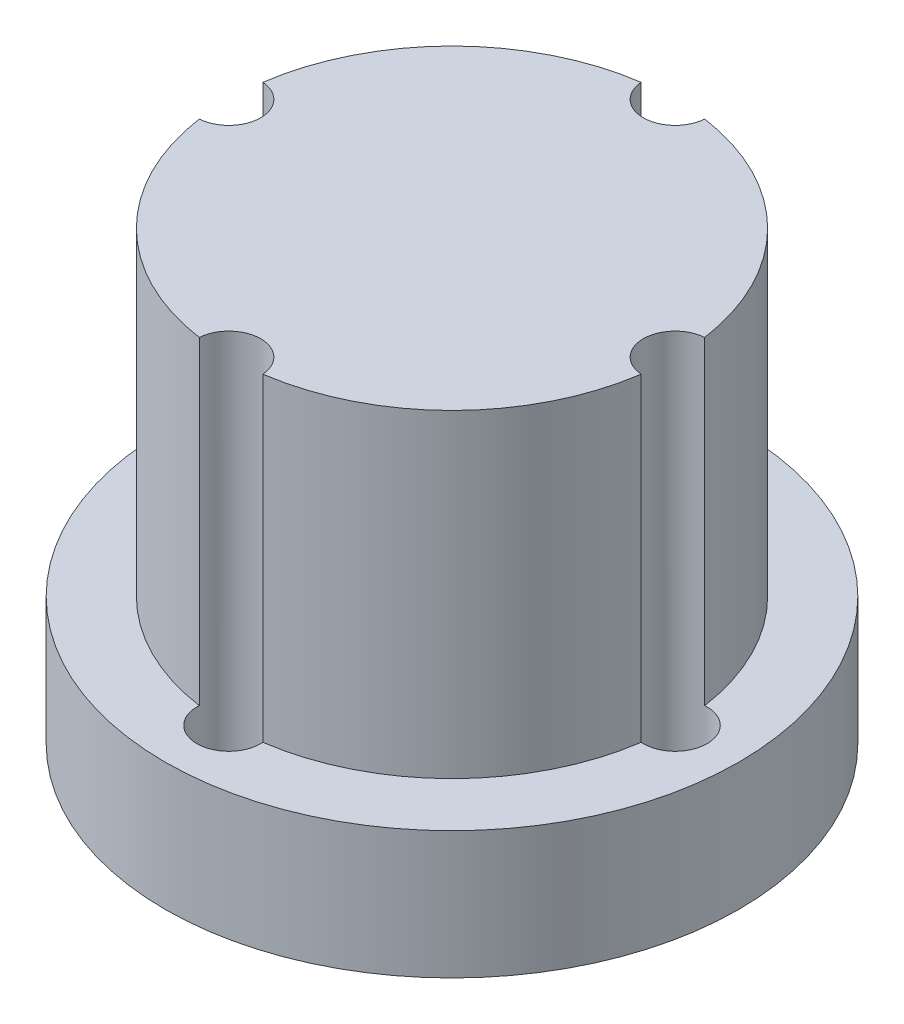
ISO-10303-21;
HEADER;
FILE_DESCRIPTION(('STEP AP214'),'2;1');
FILE_NAME('part.step','',(''),(''),'','','');
FILE_SCHEMA(('AUTOMOTIVE_DESIGN { 1 0 10303 214 1 1 1 1 }'));
ENDSEC;
DATA;
#1=APPLICATION_CONTEXT('core data for automotive mechanical design processes');
#2=APPLICATION_PROTOCOL_DEFINITION('international standard','automotive_design',2000,#1);
#3=PRODUCT_CONTEXT('',#1,'mechanical');
#4=PRODUCT('Part','Part','',(#3));
#5=PRODUCT_RELATED_PRODUCT_CATEGORY('part','',(#4));
#6=PRODUCT_DEFINITION_FORMATION('','',#4);
#7=PRODUCT_DEFINITION_CONTEXT('part definition',#1,'design');
#8=PRODUCT_DEFINITION('design','',#6,#7);
#9=PRODUCT_DEFINITION_SHAPE('','',#8);
#10=(LENGTH_UNIT() NAMED_UNIT(*) SI_UNIT(.MILLI.,.METRE.));
#11=(NAMED_UNIT(*) PLANE_ANGLE_UNIT() SI_UNIT($,.RADIAN.));
#12=(NAMED_UNIT(*) SI_UNIT($,.STERADIAN.) SOLID_ANGLE_UNIT());
#13=UNCERTAINTY_MEASURE_WITH_UNIT(LENGTH_MEASURE(1.E-05),#10,'distance_accuracy_value','');
#14=(GEOMETRIC_REPRESENTATION_CONTEXT(3) GLOBAL_UNCERTAINTY_ASSIGNED_CONTEXT((#13)) GLOBAL_UNIT_ASSIGNED_CONTEXT((#10,
#11,#12)) REPRESENTATION_CONTEXT('',''));
#15=CARTESIAN_POINT('',(0.,0.,0.));
#16=DIRECTION('',(0.,0.,1.));
#17=DIRECTION('',(1.,0.,0.));
#18=AXIS2_PLACEMENT_3D('',#15,#16,#17);
#19=CARTESIAN_POINT('',(0.,14.,0.));
#20=DIRECTION('',(0.,-1.,0.));
#21=DIRECTION('',(0.,0.,-1.));
#22=AXIS2_PLACEMENT_3D('',#19,#20,#21);
#23=CYLINDRICAL_SURFACE('',#22,9.);
#24=CARTESIAN_POINT('',(0.,0.,0.));
#25=DIRECTION('',(0.,1.,0.));
#26=DIRECTION('',(0.,0.,1.));
#27=AXIS2_PLACEMENT_3D('',#24,#25,#26);
#28=CIRCLE('',#27,9.);
#29=CARTESIAN_POINT('',(0.,0.,9.));
#30=VERTEX_POINT('',#29);
#31=EDGE_CURVE('E143',#30,#30,#28,.T.);
#32=ORIENTED_EDGE('',*,*,#31,.T.);
#33=EDGE_LOOP('',(#32));
#34=FACE_BOUND('',#33,.T.);
#35=CARTESIAN_POINT('',(0.,4.,0.));
#36=DIRECTION('',(0.,1.,0.));
#37=DIRECTION('',(0.,0.,1.));
#38=AXIS2_PLACEMENT_3D('',#35,#36,#37);
#39=CIRCLE('',#38,9.);
#40=CARTESIAN_POINT('',(0.,4.,9.));
#41=VERTEX_POINT('',#40);
#42=EDGE_CURVE('E116',#41,#41,#39,.T.);
#43=ORIENTED_EDGE('',*,*,#42,.F.);
#44=EDGE_LOOP('',(#43));
#45=FACE_BOUND('',#44,.T.);
#46=ADVANCED_FACE('F33',(#34,#45),#23,.T.);
#47=CARTESIAN_POINT('',(0.,14.,0.));
#48=DIRECTION('',(0.,1.,0.));
#49=DIRECTION('',(0.,0.,1.));
#50=AXIS2_PLACEMENT_3D('',#47,#48,#49);
#51=PLANE('',#50);
#52=CARTESIAN_POINT('',(0.,14.,7.));
#53=DIRECTION('',(0.,1.,0.));
#54=DIRECTION('',(0.,0.,1.));
#55=AXIS2_PLACEMENT_3D('',#52,#53,#54);
#56=CIRCLE('',#55,1.);
#57=CARTESIAN_POINT('',(0.997445717412067,14.,6.92857142857143));
#58=VERTEX_POINT('',#57);
#59=CARTESIAN_POINT('',(-0.997445717412068,14.,6.92857142857143));
#60=VERTEX_POINT('',#59);
#61=EDGE_CURVE('E124',#58,#60,#56,.T.);
#62=ORIENTED_EDGE('',*,*,#61,.F.);
#63=CARTESIAN_POINT('',(0.,14.,0.));
#64=DIRECTION('',(0.,1.,0.));
#65=DIRECTION('',(0.,0.,1.));
#66=AXIS2_PLACEMENT_3D('',#63,#64,#65);
#67=CIRCLE('',#66,7.);
#68=CARTESIAN_POINT('',(6.92857142857143,14.,0.997445717412068));
#69=VERTEX_POINT('',#68);
#70=EDGE_CURVE('E103',#58,#69,#67,.T.);
#71=ORIENTED_EDGE('',*,*,#70,.T.);
#72=CARTESIAN_POINT('',(7.,14.,0.));
#73=DIRECTION('',(0.,1.,0.));
#74=DIRECTION('',(0.,0.,1.));
#75=AXIS2_PLACEMENT_3D('',#72,#73,#74);
#76=CIRCLE('',#75,1.);
#77=CARTESIAN_POINT('',(6.92857142857143,14.,-0.997445717412068));
#78=VERTEX_POINT('',#77);
#79=EDGE_CURVE('E130',#78,#69,#76,.T.);
#80=ORIENTED_EDGE('',*,*,#79,.F.);
#81=CARTESIAN_POINT('',(0.997445717412066,14.,-6.92857142857143));
#82=VERTEX_POINT('',#81);
#83=EDGE_CURVE('E47',#78,#82,#67,.T.);
#84=ORIENTED_EDGE('',*,*,#83,.T.);
#85=CARTESIAN_POINT('',(0.,14.,-7.));
#86=DIRECTION('',(0.,1.,0.));
#87=DIRECTION('',(0.,0.,1.));
#88=AXIS2_PLACEMENT_3D('',#85,#86,#87);
#89=CIRCLE('',#88,0.999999999999999);
#90=CARTESIAN_POINT('',(-0.997445717412065,14.,-6.92857142857143));
#91=VERTEX_POINT('',#90);
#92=EDGE_CURVE('E138',#91,#82,#89,.T.);
#93=ORIENTED_EDGE('',*,*,#92,.F.);
#94=CARTESIAN_POINT('',(-6.92857142857143,14.,-0.997445717412068));
#95=VERTEX_POINT('',#94);
#96=EDGE_CURVE('E169',#91,#95,#67,.T.);
#97=ORIENTED_EDGE('',*,*,#96,.T.);
#98=CARTESIAN_POINT('',(-7.,14.,0.));
#99=DIRECTION('',(0.,1.,0.));
#100=DIRECTION('',(0.,0.,1.));
#101=AXIS2_PLACEMENT_3D('',#98,#99,#100);
#102=CIRCLE('',#101,1.);
#103=CARTESIAN_POINT('',(-6.92857142857143,14.,0.997445717412067));
#104=VERTEX_POINT('',#103);
#105=EDGE_CURVE('E134',#104,#95,#102,.T.);
#106=ORIENTED_EDGE('',*,*,#105,.F.);
#107=EDGE_CURVE('E168',#104,#60,#67,.T.);
#108=ORIENTED_EDGE('',*,*,#107,.T.);
#109=EDGE_LOOP('',(#62,#71,#80,#84,#93,#97,#106,#108));
#110=FACE_BOUND('',#109,.T.);
#111=ADVANCED_FACE('F166',(#110),#51,.T.);
#112=CARTESIAN_POINT('',(0.,-6.,-7.));
#113=DIRECTION('',(0.,1.,0.));
#114=DIRECTION('',(0.,0.,1.));
#115=AXIS2_PLACEMENT_3D('',#112,#113,#114);
#116=CYLINDRICAL_SURFACE('',#115,0.999999999999999);
#117=CARTESIAN_POINT('',(0.,0.,-7.));
#118=DIRECTION('',(0.,1.,0.));
#119=DIRECTION('',(0.,0.,1.));
#120=AXIS2_PLACEMENT_3D('',#117,#118,#119);
#121=CIRCLE('',#120,0.999999999999999);
#122=CARTESIAN_POINT('',(0.,0.,-6.));
#123=VERTEX_POINT('',#122);
#124=EDGE_CURVE('E141',#123,#123,#121,.T.);
#125=ORIENTED_EDGE('',*,*,#124,.F.);
#126=EDGE_LOOP('',(#125));
#127=FACE_BOUND('',#126,.T.);
#128=DIRECTION('',(0.,1.,0.));
#129=VECTOR('',#128,1.);
#130=CARTESIAN_POINT('',(0.997445717412066,9.,-6.92857142857143));
#131=LINE('',#130,#129);
#132=CARTESIAN_POINT('',(0.997445717412066,4.,-6.92857142857143));
#133=VERTEX_POINT('',#132);
#134=EDGE_CURVE('E126',#133,#82,#131,.T.);
#135=ORIENTED_EDGE('',*,*,#134,.F.);
#136=CARTESIAN_POINT('',(0.,4.,-7.));
#137=DIRECTION('',(0.,1.,0.));
#138=DIRECTION('',(0.,0.,1.));
#139=AXIS2_PLACEMENT_3D('',#136,#137,#138);
#140=CIRCLE('',#139,0.999999999999999);
#141=CARTESIAN_POINT('',(-0.997445717412065,4.,-6.92857142857143));
#142=VERTEX_POINT('',#141);
#143=EDGE_CURVE('E121',#142,#133,#140,.F.);
#144=ORIENTED_EDGE('',*,*,#143,.F.);
#145=DIRECTION('',(0.,1.,0.));
#146=VECTOR('',#145,1.);
#147=CARTESIAN_POINT('',(-0.997445717412066,9.,-6.92857142857143));
#148=LINE('',#147,#146);
#149=EDGE_CURVE('E187',#91,#142,#148,.F.);
#150=ORIENTED_EDGE('',*,*,#149,.F.);
#151=ORIENTED_EDGE('',*,*,#92,.T.);
#152=EDGE_LOOP('',(#135,#144,#150,#151));
#153=FACE_BOUND('',#152,.T.);
#154=ADVANCED_FACE('F189',(#127,#153),#116,.F.);
#155=CARTESIAN_POINT('',(0.,-6.,7.));
#156=DIRECTION('',(0.,1.,0.));
#157=DIRECTION('',(0.,0.,1.));
#158=AXIS2_PLACEMENT_3D('',#155,#156,#157);
#159=CYLINDRICAL_SURFACE('',#158,1.);
#160=CARTESIAN_POINT('',(0.,0.,7.));
#161=DIRECTION('',(0.,1.,0.));
#162=DIRECTION('',(0.,0.,1.));
#163=AXIS2_PLACEMENT_3D('',#160,#161,#162);
#164=CIRCLE('',#163,1.);
#165=CARTESIAN_POINT('',(0.,0.,8.));
#166=VERTEX_POINT('',#165);
#167=EDGE_CURVE('E133',#166,#166,#164,.T.);
#168=ORIENTED_EDGE('',*,*,#167,.F.);
#169=EDGE_LOOP('',(#168));
#170=FACE_BOUND('',#169,.T.);
#171=DIRECTION('',(0.,1.,0.));
#172=VECTOR('',#171,1.);
#173=CARTESIAN_POINT('',(-0.997445717412068,9.,6.92857142857143));
#174=LINE('',#173,#172);
#175=CARTESIAN_POINT('',(-0.997445717412068,4.,6.92857142857143));
#176=VERTEX_POINT('',#175);
#177=EDGE_CURVE('E55',#176,#60,#174,.T.);
#178=ORIENTED_EDGE('',*,*,#177,.F.);
#179=CARTESIAN_POINT('',(0.,4.,7.));
#180=DIRECTION('',(0.,1.,0.));
#181=DIRECTION('',(0.,0.,1.));
#182=AXIS2_PLACEMENT_3D('',#179,#180,#181);
#183=CIRCLE('',#182,1.);
#184=CARTESIAN_POINT('',(0.997445717412067,4.,6.92857142857143));
#185=VERTEX_POINT('',#184);
#186=EDGE_CURVE('E113',#185,#176,#183,.F.);
#187=ORIENTED_EDGE('',*,*,#186,.F.);
#188=DIRECTION('',(0.,1.,0.));
#189=VECTOR('',#188,1.);
#190=CARTESIAN_POINT('',(0.997445717412068,9.,6.92857142857143));
#191=LINE('',#190,#189);
#192=EDGE_CURVE('E97',#58,#185,#191,.F.);
#193=ORIENTED_EDGE('',*,*,#192,.F.);
#194=ORIENTED_EDGE('',*,*,#61,.T.);
#195=EDGE_LOOP('',(#178,#187,#193,#194));
#196=FACE_BOUND('',#195,.T.);
#197=ADVANCED_FACE('F120',(#170,#196),#159,.F.);
#198=CARTESIAN_POINT('',(-7.,-6.,0.));
#199=DIRECTION('',(0.,1.,0.));
#200=DIRECTION('',(0.,0.,1.));
#201=AXIS2_PLACEMENT_3D('',#198,#199,#200);
#202=CYLINDRICAL_SURFACE('',#201,1.);
#203=CARTESIAN_POINT('',(-7.,0.,0.));
#204=DIRECTION('',(0.,1.,0.));
#205=DIRECTION('',(0.,0.,1.));
#206=AXIS2_PLACEMENT_3D('',#203,#204,#205);
#207=CIRCLE('',#206,1.);
#208=CARTESIAN_POINT('',(-7.,0.,1.));
#209=VERTEX_POINT('',#208);
#210=EDGE_CURVE('E151',#209,#209,#207,.T.);
#211=ORIENTED_EDGE('',*,*,#210,.F.);
#212=EDGE_LOOP('',(#211));
#213=FACE_BOUND('',#212,.T.);
#214=DIRECTION('',(0.,1.,0.));
#215=VECTOR('',#214,1.);
#216=CARTESIAN_POINT('',(-6.92857142857143,9.,-0.997445717412068));
#217=LINE('',#216,#215);
#218=CARTESIAN_POINT('',(-6.92857142857143,4.,-0.997445717412068));
#219=VERTEX_POINT('',#218);
#220=EDGE_CURVE('E108',#219,#95,#217,.T.);
#221=ORIENTED_EDGE('',*,*,#220,.F.);
#222=CARTESIAN_POINT('',(-7.,4.,0.));
#223=DIRECTION('',(0.,1.,0.));
#224=DIRECTION('',(0.,0.,1.));
#225=AXIS2_PLACEMENT_3D('',#222,#223,#224);
#226=CIRCLE('',#225,1.);
#227=CARTESIAN_POINT('',(-6.92857142857143,4.,0.997445717412067));
#228=VERTEX_POINT('',#227);
#229=EDGE_CURVE('E122',#228,#219,#226,.F.);
#230=ORIENTED_EDGE('',*,*,#229,.F.);
#231=DIRECTION('',(0.,1.,0.));
#232=VECTOR('',#231,1.);
#233=CARTESIAN_POINT('',(-6.92857142857143,9.,0.997445717412068));
#234=LINE('',#233,#232);
#235=EDGE_CURVE('E181',#104,#228,#234,.F.);
#236=ORIENTED_EDGE('',*,*,#235,.F.);
#237=ORIENTED_EDGE('',*,*,#105,.T.);
#238=EDGE_LOOP('',(#221,#230,#236,#237));
#239=FACE_BOUND('',#238,.T.);
#240=ADVANCED_FACE('F179',(#213,#239),#202,.F.);
#241=CARTESIAN_POINT('',(7.,-6.,0.));
#242=DIRECTION('',(0.,1.,0.));
#243=DIRECTION('',(0.,0.,1.));
#244=AXIS2_PLACEMENT_3D('',#241,#242,#243);
#245=CYLINDRICAL_SURFACE('',#244,1.);
#246=CARTESIAN_POINT('',(7.,0.,0.));
#247=DIRECTION('',(0.,1.,0.));
#248=DIRECTION('',(0.,0.,1.));
#249=AXIS2_PLACEMENT_3D('',#246,#247,#248);
#250=CIRCLE('',#249,1.);
#251=CARTESIAN_POINT('',(7.,0.,1.));
#252=VERTEX_POINT('',#251);
#253=EDGE_CURVE('E142',#252,#252,#250,.T.);
#254=ORIENTED_EDGE('',*,*,#253,.F.);
#255=EDGE_LOOP('',(#254));
#256=FACE_BOUND('',#255,.T.);
#257=DIRECTION('',(0.,1.,0.));
#258=VECTOR('',#257,1.);
#259=CARTESIAN_POINT('',(6.92857142857143,9.,0.997445717412068));
#260=LINE('',#259,#258);
#261=CARTESIAN_POINT('',(6.92857142857143,4.,0.997445717412068));
#262=VERTEX_POINT('',#261);
#263=EDGE_CURVE('E11',#262,#69,#260,.T.);
#264=ORIENTED_EDGE('',*,*,#263,.F.);
#265=CARTESIAN_POINT('',(7.,4.,0.));
#266=DIRECTION('',(0.,1.,0.));
#267=DIRECTION('',(0.,0.,1.));
#268=AXIS2_PLACEMENT_3D('',#265,#266,#267);
#269=CIRCLE('',#268,1.);
#270=CARTESIAN_POINT('',(6.92857142857143,4.,-0.997445717412068));
#271=VERTEX_POINT('',#270);
#272=EDGE_CURVE('E40',#271,#262,#269,.F.);
#273=ORIENTED_EDGE('',*,*,#272,.F.);
#274=DIRECTION('',(0.,1.,0.));
#275=VECTOR('',#274,1.);
#276=CARTESIAN_POINT('',(6.92857142857143,9.,-0.997445717412068));
#277=LINE('',#276,#275);
#278=EDGE_CURVE('E146',#78,#271,#277,.F.);
#279=ORIENTED_EDGE('',*,*,#278,.F.);
#280=ORIENTED_EDGE('',*,*,#79,.T.);
#281=EDGE_LOOP('',(#264,#273,#279,#280));
#282=FACE_BOUND('',#281,.T.);
#283=ADVANCED_FACE('F164',(#256,#282),#245,.F.);
#284=CARTESIAN_POINT('',(0.,0.,0.));
#285=DIRECTION('',(0.,1.,0.));
#286=DIRECTION('',(0.,0.,1.));
#287=AXIS2_PLACEMENT_3D('',#284,#285,#286);
#288=PLANE('',#287);
#289=ORIENTED_EDGE('',*,*,#253,.T.);
#290=EDGE_LOOP('',(#289));
#291=FACE_BOUND('',#290,.T.);
#292=ORIENTED_EDGE('',*,*,#210,.T.);
#293=EDGE_LOOP('',(#292));
#294=FACE_BOUND('',#293,.T.);
#295=ORIENTED_EDGE('',*,*,#167,.T.);
#296=EDGE_LOOP('',(#295));
#297=FACE_BOUND('',#296,.T.);
#298=ORIENTED_EDGE('',*,*,#124,.T.);
#299=EDGE_LOOP('',(#298));
#300=FACE_BOUND('',#299,.T.);
#301=ORIENTED_EDGE('',*,*,#31,.F.);
#302=EDGE_LOOP('',(#301));
#303=FACE_BOUND('',#302,.T.);
#304=ADVANCED_FACE('F211',(#291,#294,#297,#300,#303),#288,.F.);
#305=CARTESIAN_POINT('',(0.,4.,0.));
#306=DIRECTION('',(0.,1.,0.));
#307=DIRECTION('',(0.,0.,1.));
#308=AXIS2_PLACEMENT_3D('',#305,#306,#307);
#309=PLANE('',#308);
#310=ORIENTED_EDGE('',*,*,#42,.T.);
#311=EDGE_LOOP('',(#310));
#312=FACE_BOUND('',#311,.T.);
#313=ORIENTED_EDGE('',*,*,#143,.T.);
#314=CARTESIAN_POINT('',(0.,4.,0.));
#315=DIRECTION('',(0.,1.,0.));
#316=DIRECTION('',(0.,0.,1.));
#317=AXIS2_PLACEMENT_3D('',#314,#315,#316);
#318=CIRCLE('',#317,7.);
#319=EDGE_CURVE('E117',#271,#133,#318,.T.);
#320=ORIENTED_EDGE('',*,*,#319,.F.);
#321=ORIENTED_EDGE('',*,*,#272,.T.);
#322=EDGE_CURVE('E100',#185,#262,#318,.T.);
#323=ORIENTED_EDGE('',*,*,#322,.F.);
#324=ORIENTED_EDGE('',*,*,#186,.T.);
#325=EDGE_CURVE('E119',#228,#176,#318,.T.);
#326=ORIENTED_EDGE('',*,*,#325,.F.);
#327=ORIENTED_EDGE('',*,*,#229,.T.);
#328=EDGE_CURVE('E163',#142,#219,#318,.T.);
#329=ORIENTED_EDGE('',*,*,#328,.F.);
#330=EDGE_LOOP('',(#313,#320,#321,#323,#324,#326,#327,#329));
#331=FACE_BOUND('',#330,.T.);
#332=ADVANCED_FACE('F111',(#312,#331),#309,.T.);
#333=CARTESIAN_POINT('',(0.,4.,0.));
#334=DIRECTION('',(0.,1.,0.));
#335=DIRECTION('',(0.,0.,1.));
#336=AXIS2_PLACEMENT_3D('',#333,#334,#335);
#337=CYLINDRICAL_SURFACE('',#336,7.);
#338=ORIENTED_EDGE('',*,*,#134,.T.);
#339=ORIENTED_EDGE('',*,*,#83,.F.);
#340=ORIENTED_EDGE('',*,*,#278,.T.);
#341=ORIENTED_EDGE('',*,*,#319,.T.);
#342=EDGE_LOOP('',(#338,#339,#340,#341));
#343=FACE_BOUND('',#342,.T.);
#344=ADVANCED_FACE('F157',(#343),#337,.T.);
#345=ORIENTED_EDGE('',*,*,#149,.T.);
#346=ORIENTED_EDGE('',*,*,#328,.T.);
#347=ORIENTED_EDGE('',*,*,#220,.T.);
#348=ORIENTED_EDGE('',*,*,#96,.F.);
#349=EDGE_LOOP('',(#345,#346,#347,#348));
#350=FACE_BOUND('',#349,.T.);
#351=ADVANCED_FACE('F191',(#350),#337,.T.);
#352=ORIENTED_EDGE('',*,*,#177,.T.);
#353=ORIENTED_EDGE('',*,*,#107,.F.);
#354=ORIENTED_EDGE('',*,*,#235,.T.);
#355=ORIENTED_EDGE('',*,*,#325,.T.);
#356=EDGE_LOOP('',(#352,#353,#354,#355));
#357=FACE_BOUND('',#356,.T.);
#358=ADVANCED_FACE('F192',(#357),#337,.T.);
#359=ORIENTED_EDGE('',*,*,#192,.T.);
#360=ORIENTED_EDGE('',*,*,#322,.T.);
#361=ORIENTED_EDGE('',*,*,#263,.T.);
#362=ORIENTED_EDGE('',*,*,#70,.F.);
#363=EDGE_LOOP('',(#359,#360,#361,#362));
#364=FACE_BOUND('',#363,.T.);
#365=ADVANCED_FACE('F99',(#364),#337,.T.);
#366=CLOSED_SHELL('',(#46,#111,#154,#197,#240,#283,#304,#332,#344,#351,#358,#365));
#367=MANIFOLD_SOLID_BREP('B2',#366);
#368=ADVANCED_BREP_SHAPE_REPRESENTATION('',(#18,#367),#14);
#369=SHAPE_DEFINITION_REPRESENTATION(#9,#368);
ENDSEC;
END-ISO-10303-21;
